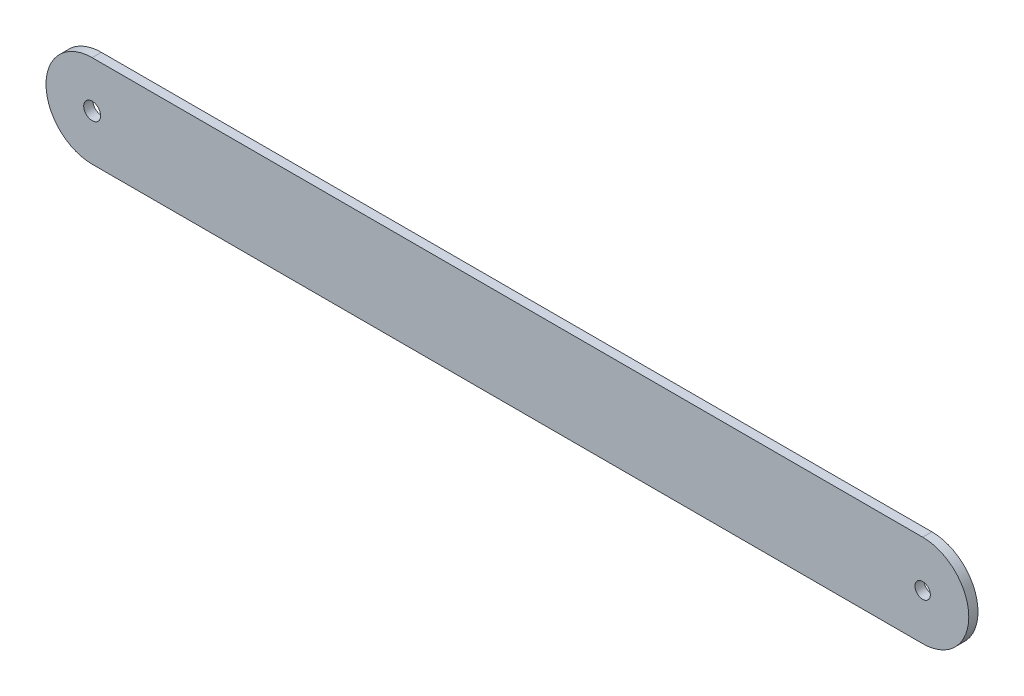
ISO-10303-21;
HEADER;
FILE_DESCRIPTION(('STEP AP214'),'2;1');
FILE_NAME('part.step','',(''),(''),'','','');
FILE_SCHEMA(('AUTOMOTIVE_DESIGN { 1 0 10303 214 1 1 1 1 }'));
ENDSEC;
DATA;
#1=APPLICATION_CONTEXT('core data for automotive mechanical design processes');
#2=APPLICATION_PROTOCOL_DEFINITION('international standard','automotive_design',2000,#1);
#3=PRODUCT_CONTEXT('',#1,'mechanical');
#4=PRODUCT('Part','Part','',(#3));
#5=PRODUCT_RELATED_PRODUCT_CATEGORY('part','',(#4));
#6=PRODUCT_DEFINITION_FORMATION('','',#4);
#7=PRODUCT_DEFINITION_CONTEXT('part definition',#1,'design');
#8=PRODUCT_DEFINITION('design','',#6,#7);
#9=PRODUCT_DEFINITION_SHAPE('','',#8);
#10=(LENGTH_UNIT() NAMED_UNIT(*) SI_UNIT(.MILLI.,.METRE.));
#11=(NAMED_UNIT(*) PLANE_ANGLE_UNIT() SI_UNIT($,.RADIAN.));
#12=(NAMED_UNIT(*) SI_UNIT($,.STERADIAN.) SOLID_ANGLE_UNIT());
#13=UNCERTAINTY_MEASURE_WITH_UNIT(LENGTH_MEASURE(1.E-05),#10,'distance_accuracy_value','');
#14=(GEOMETRIC_REPRESENTATION_CONTEXT(3) GLOBAL_UNCERTAINTY_ASSIGNED_CONTEXT((#13)) GLOBAL_UNIT_ASSIGNED_CONTEXT((#10,
#11,#12)) REPRESENTATION_CONTEXT('',''));
#15=CARTESIAN_POINT('',(0.,0.,0.));
#16=DIRECTION('',(0.,0.,1.));
#17=DIRECTION('',(1.,0.,0.));
#18=AXIS2_PLACEMENT_3D('',#15,#16,#17);
#19=CARTESIAN_POINT('',(-15.7660280800599,30.286446481424,3.));
#20=DIRECTION('',(0.,0.,1.));
#21=DIRECTION('',(1.,0.,0.));
#22=AXIS2_PLACEMENT_3D('',#19,#20,#21);
#23=PLANE('',#22);
#24=CARTESIAN_POINT('',(-285.76602808006,30.286446481424,3.));
#25=DIRECTION('',(0.,0.,1.));
#26=DIRECTION('',(1.,0.,0.));
#27=AXIS2_PLACEMENT_3D('',#24,#25,#26);
#28=CIRCLE('',#27,2.74999999999998);
#29=CARTESIAN_POINT('',(-283.01602808006,30.286446481424,3.));
#30=VERTEX_POINT('',#29);
#31=EDGE_CURVE('E104',#30,#30,#28,.T.);
#32=ORIENTED_EDGE('',*,*,#31,.F.);
#33=EDGE_LOOP('',(#32));
#34=FACE_BOUND('',#33,.T.);
#35=CARTESIAN_POINT('',(-15.7660280800599,30.286446481424,3.));
#36=DIRECTION('',(0.,0.,1.));
#37=DIRECTION('',(1.,0.,0.));
#38=AXIS2_PLACEMENT_3D('',#35,#36,#37);
#39=CIRCLE('',#38,15.);
#40=CARTESIAN_POINT('',(-15.7660280800599,15.286446481424,3.));
#41=VERTEX_POINT('',#40);
#42=CARTESIAN_POINT('',(-15.7660280800599,45.286446481424,3.));
#43=VERTEX_POINT('',#42);
#44=EDGE_CURVE('E89',#41,#43,#39,.T.);
#45=ORIENTED_EDGE('',*,*,#44,.T.);
#46=DIRECTION('',(-1.,0.,0.));
#47=VECTOR('',#46,1.);
#48=CARTESIAN_POINT('',(-15.7660280800599,45.286446481424,3.));
#49=LINE('',#48,#47);
#50=CARTESIAN_POINT('',(-285.76602808006,45.286446481424,3.));
#51=VERTEX_POINT('',#50);
#52=EDGE_CURVE('E84',#43,#51,#49,.T.);
#53=ORIENTED_EDGE('',*,*,#52,.T.);
#54=CARTESIAN_POINT('',(-285.76602808006,30.286446481424,3.));
#55=DIRECTION('',(0.,0.,1.));
#56=DIRECTION('',(1.,0.,0.));
#57=AXIS2_PLACEMENT_3D('',#54,#55,#56);
#58=CIRCLE('',#57,15.);
#59=CARTESIAN_POINT('',(-285.76602808006,15.286446481424,3.));
#60=VERTEX_POINT('',#59);
#61=EDGE_CURVE('E87',#51,#60,#58,.T.);
#62=ORIENTED_EDGE('',*,*,#61,.T.);
#63=DIRECTION('',(1.,0.,0.));
#64=VECTOR('',#63,1.);
#65=CARTESIAN_POINT('',(-285.76602808006,15.286446481424,3.));
#66=LINE('',#65,#64);
#67=EDGE_CURVE('E54',#60,#41,#66,.T.);
#68=ORIENTED_EDGE('',*,*,#67,.T.);
#69=EDGE_LOOP('',(#45,#53,#62,#68));
#70=FACE_BOUND('',#69,.T.);
#71=CARTESIAN_POINT('',(-15.7660280800599,30.286446481424,3.));
#72=DIRECTION('',(0.,0.,1.));
#73=DIRECTION('',(1.,0.,0.));
#74=AXIS2_PLACEMENT_3D('',#71,#72,#73);
#75=CIRCLE('',#74,2.5);
#76=CARTESIAN_POINT('',(-13.2660280800599,30.286446481424,3.));
#77=VERTEX_POINT('',#76);
#78=EDGE_CURVE('E119',#77,#77,#75,.T.);
#79=ORIENTED_EDGE('',*,*,#78,.F.);
#80=EDGE_LOOP('',(#79));
#81=FACE_BOUND('',#80,.T.);
#82=ADVANCED_FACE('F37',(#34,#70,#81),#23,.T.);
#83=CARTESIAN_POINT('',(-15.7660280800599,30.286446481424,0.));
#84=DIRECTION('',(0.,0.,1.));
#85=DIRECTION('',(1.,0.,0.));
#86=AXIS2_PLACEMENT_3D('',#83,#84,#85);
#87=PLANE('',#86);
#88=CARTESIAN_POINT('',(-15.7660280800599,30.286446481424,0.));
#89=DIRECTION('',(0.,0.,1.));
#90=DIRECTION('',(1.,0.,0.));
#91=AXIS2_PLACEMENT_3D('',#88,#89,#90);
#92=CIRCLE('',#91,15.);
#93=CARTESIAN_POINT('',(-15.7660280800599,15.286446481424,0.));
#94=VERTEX_POINT('',#93);
#95=CARTESIAN_POINT('',(-15.7660280800599,45.286446481424,0.));
#96=VERTEX_POINT('',#95);
#97=EDGE_CURVE('E101',#94,#96,#92,.T.);
#98=ORIENTED_EDGE('',*,*,#97,.F.);
#99=DIRECTION('',(1.,0.,0.));
#100=VECTOR('',#99,1.);
#101=CARTESIAN_POINT('',(-285.76602808006,15.286446481424,0.));
#102=LINE('',#101,#100);
#103=CARTESIAN_POINT('',(-285.76602808006,15.286446481424,0.));
#104=VERTEX_POINT('',#103);
#105=EDGE_CURVE('E77',#104,#94,#102,.T.);
#106=ORIENTED_EDGE('',*,*,#105,.F.);
#107=CARTESIAN_POINT('',(-285.76602808006,30.286446481424,0.));
#108=DIRECTION('',(0.,0.,1.));
#109=DIRECTION('',(1.,0.,0.));
#110=AXIS2_PLACEMENT_3D('',#107,#108,#109);
#111=CIRCLE('',#110,15.);
#112=CARTESIAN_POINT('',(-285.76602808006,45.286446481424,0.));
#113=VERTEX_POINT('',#112);
#114=EDGE_CURVE('E71',#113,#104,#111,.T.);
#115=ORIENTED_EDGE('',*,*,#114,.F.);
#116=DIRECTION('',(-1.,0.,0.));
#117=VECTOR('',#116,1.);
#118=CARTESIAN_POINT('',(-15.7660280800599,45.286446481424,0.));
#119=LINE('',#118,#117);
#120=EDGE_CURVE('E93',#96,#113,#119,.T.);
#121=ORIENTED_EDGE('',*,*,#120,.F.);
#122=EDGE_LOOP('',(#98,#106,#115,#121));
#123=FACE_BOUND('',#122,.T.);
#124=CARTESIAN_POINT('',(-285.76602808006,30.286446481424,0.));
#125=DIRECTION('',(0.,0.,1.));
#126=DIRECTION('',(1.,0.,0.));
#127=AXIS2_PLACEMENT_3D('',#124,#125,#126);
#128=CIRCLE('',#127,2.74999999999998);
#129=CARTESIAN_POINT('',(-283.01602808006,30.286446481424,0.));
#130=VERTEX_POINT('',#129);
#131=EDGE_CURVE('E116',#130,#130,#128,.T.);
#132=ORIENTED_EDGE('',*,*,#131,.T.);
#133=EDGE_LOOP('',(#132));
#134=FACE_BOUND('',#133,.T.);
#135=CARTESIAN_POINT('',(-15.7660280800599,30.286446481424,0.));
#136=DIRECTION('',(0.,0.,1.));
#137=DIRECTION('',(1.,0.,0.));
#138=AXIS2_PLACEMENT_3D('',#135,#136,#137);
#139=CIRCLE('',#138,2.5);
#140=CARTESIAN_POINT('',(-13.2660280800599,30.286446481424,0.));
#141=VERTEX_POINT('',#140);
#142=EDGE_CURVE('E122',#141,#141,#139,.T.);
#143=ORIENTED_EDGE('',*,*,#142,.T.);
#144=EDGE_LOOP('',(#143));
#145=FACE_BOUND('',#144,.T.);
#146=ADVANCED_FACE('F112',(#123,#134,#145),#87,.F.);
#147=CARTESIAN_POINT('',(-15.7660280800599,30.286446481424,3.));
#148=DIRECTION('',(0.,0.,-1.));
#149=DIRECTION('',(-1.,0.,0.));
#150=AXIS2_PLACEMENT_3D('',#147,#148,#149);
#151=CYLINDRICAL_SURFACE('',#150,15.);
#152=ORIENTED_EDGE('',*,*,#97,.T.);
#153=DIRECTION('',(0.,0.,-1.));
#154=VECTOR('',#153,1.);
#155=CARTESIAN_POINT('',(-15.7660280800599,45.286446481424,3.));
#156=LINE('',#155,#154);
#157=EDGE_CURVE('E11',#43,#96,#156,.T.);
#158=ORIENTED_EDGE('',*,*,#157,.F.);
#159=ORIENTED_EDGE('',*,*,#44,.F.);
#160=DIRECTION('',(0.,0.,-1.));
#161=VECTOR('',#160,1.);
#162=CARTESIAN_POINT('',(-15.7660280800599,15.286446481424,3.));
#163=LINE('',#162,#161);
#164=EDGE_CURVE('E97',#41,#94,#163,.T.);
#165=ORIENTED_EDGE('',*,*,#164,.T.);
#166=EDGE_LOOP('',(#152,#158,#159,#165));
#167=FACE_BOUND('',#166,.T.);
#168=ADVANCED_FACE('F39',(#167),#151,.T.);
#169=CARTESIAN_POINT('',(-15.7660280800599,45.286446481424,3.));
#170=DIRECTION('',(0.,-1.,0.));
#171=DIRECTION('',(1.,0.,0.));
#172=AXIS2_PLACEMENT_3D('',#169,#170,#171);
#173=PLANE('',#172);
#174=ORIENTED_EDGE('',*,*,#120,.T.);
#175=DIRECTION('',(0.,0.,-1.));
#176=VECTOR('',#175,1.);
#177=CARTESIAN_POINT('',(-285.76602808006,45.286446481424,3.));
#178=LINE('',#177,#176);
#179=EDGE_CURVE('E46',#51,#113,#178,.T.);
#180=ORIENTED_EDGE('',*,*,#179,.F.);
#181=ORIENTED_EDGE('',*,*,#52,.F.);
#182=ORIENTED_EDGE('',*,*,#157,.T.);
#183=EDGE_LOOP('',(#174,#180,#181,#182));
#184=FACE_BOUND('',#183,.T.);
#185=ADVANCED_FACE('F92',(#184),#173,.F.);
#186=CARTESIAN_POINT('',(-285.76602808006,30.286446481424,3.));
#187=DIRECTION('',(0.,0.,-1.));
#188=DIRECTION('',(-1.,0.,0.));
#189=AXIS2_PLACEMENT_3D('',#186,#187,#188);
#190=CYLINDRICAL_SURFACE('',#189,15.);
#191=ORIENTED_EDGE('',*,*,#114,.T.);
#192=DIRECTION('',(0.,0.,-1.));
#193=VECTOR('',#192,1.);
#194=CARTESIAN_POINT('',(-285.76602808006,15.286446481424,3.));
#195=LINE('',#194,#193);
#196=EDGE_CURVE('E94',#60,#104,#195,.T.);
#197=ORIENTED_EDGE('',*,*,#196,.F.);
#198=ORIENTED_EDGE('',*,*,#61,.F.);
#199=ORIENTED_EDGE('',*,*,#179,.T.);
#200=EDGE_LOOP('',(#191,#197,#198,#199));
#201=FACE_BOUND('',#200,.T.);
#202=ADVANCED_FACE('F95',(#201),#190,.T.);
#203=CARTESIAN_POINT('',(-285.76602808006,15.286446481424,3.));
#204=DIRECTION('',(0.,1.,0.));
#205=DIRECTION('',(0.,0.,1.));
#206=AXIS2_PLACEMENT_3D('',#203,#204,#205);
#207=PLANE('',#206);
#208=ORIENTED_EDGE('',*,*,#105,.T.);
#209=ORIENTED_EDGE('',*,*,#164,.F.);
#210=ORIENTED_EDGE('',*,*,#67,.F.);
#211=ORIENTED_EDGE('',*,*,#196,.T.);
#212=EDGE_LOOP('',(#208,#209,#210,#211));
#213=FACE_BOUND('',#212,.T.);
#214=ADVANCED_FACE('F109',(#213),#207,.F.);
#215=CARTESIAN_POINT('',(-285.76602808006,30.286446481424,3.));
#216=DIRECTION('',(0.,0.,-1.));
#217=DIRECTION('',(-1.,0.,0.));
#218=AXIS2_PLACEMENT_3D('',#215,#216,#217);
#219=CYLINDRICAL_SURFACE('',#218,2.74999999999998);
#220=ORIENTED_EDGE('',*,*,#31,.T.);
#221=EDGE_LOOP('',(#220));
#222=FACE_BOUND('',#221,.T.);
#223=ORIENTED_EDGE('',*,*,#131,.F.);
#224=EDGE_LOOP('',(#223));
#225=FACE_BOUND('',#224,.T.);
#226=ADVANCED_FACE('F139',(#222,#225),#219,.F.);
#227=CARTESIAN_POINT('',(-15.7660280800599,30.286446481424,3.));
#228=DIRECTION('',(0.,0.,-1.));
#229=DIRECTION('',(-1.,0.,0.));
#230=AXIS2_PLACEMENT_3D('',#227,#228,#229);
#231=CYLINDRICAL_SURFACE('',#230,2.5);
#232=ORIENTED_EDGE('',*,*,#78,.T.);
#233=EDGE_LOOP('',(#232));
#234=FACE_BOUND('',#233,.T.);
#235=ORIENTED_EDGE('',*,*,#142,.F.);
#236=EDGE_LOOP('',(#235));
#237=FACE_BOUND('',#236,.T.);
#238=ADVANCED_FACE('F128',(#234,#237),#231,.F.);
#239=CLOSED_SHELL('',(#82,#146,#168,#185,#202,#214,#226,#238));
#240=MANIFOLD_SOLID_BREP('B2',#239);
#241=ADVANCED_BREP_SHAPE_REPRESENTATION('',(#18,#240),#14);
#242=SHAPE_DEFINITION_REPRESENTATION(#9,#241);
ENDSEC;
END-ISO-10303-21;
